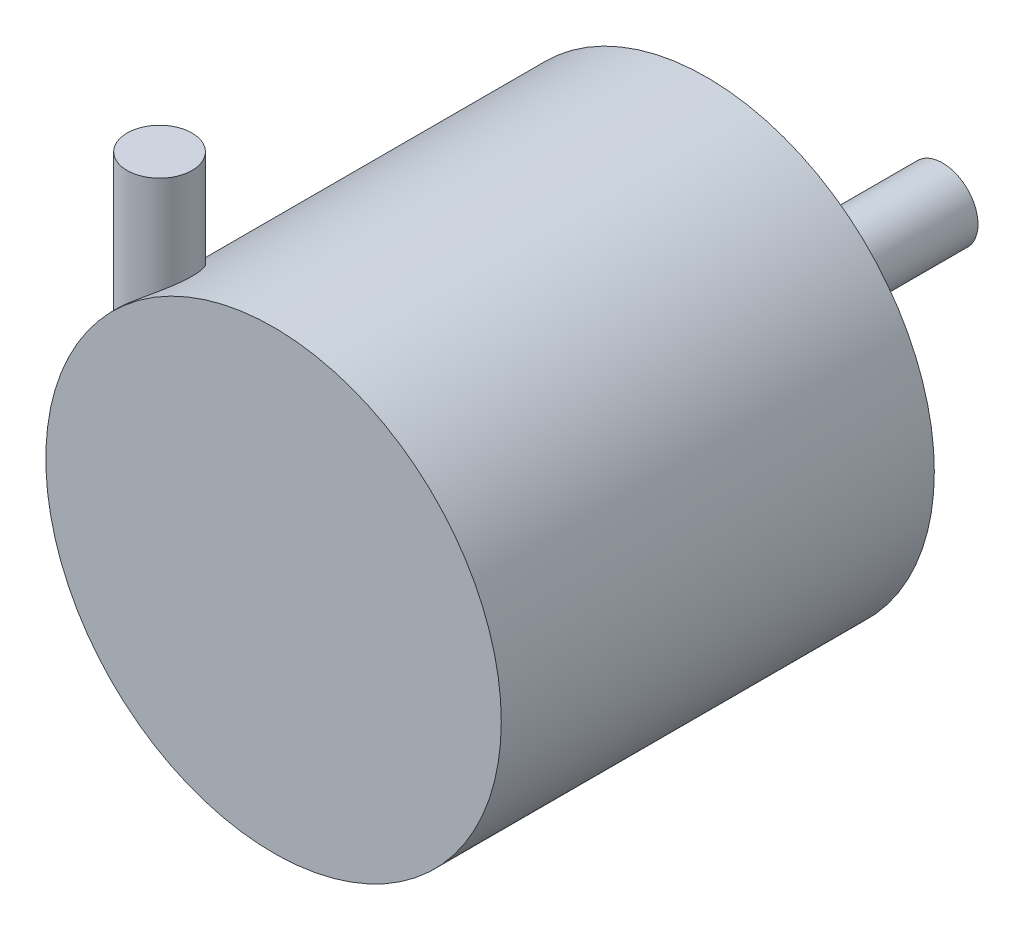
ISO-10303-21;
HEADER;
FILE_DESCRIPTION(('STEP AP214'),'2;1');
FILE_NAME('part.step','',(''),(''),'','','');
FILE_SCHEMA(('AUTOMOTIVE_DESIGN { 1 0 10303 214 1 1 1 1 }'));
ENDSEC;
DATA;
#1=APPLICATION_CONTEXT('core data for automotive mechanical design processes');
#2=APPLICATION_PROTOCOL_DEFINITION('international standard','automotive_design',2000,#1);
#3=PRODUCT_CONTEXT('',#1,'mechanical');
#4=PRODUCT('Part','Part','',(#3));
#5=PRODUCT_RELATED_PRODUCT_CATEGORY('part','',(#4));
#6=PRODUCT_DEFINITION_FORMATION('','',#4);
#7=PRODUCT_DEFINITION_CONTEXT('part definition',#1,'design');
#8=PRODUCT_DEFINITION('design','',#6,#7);
#9=PRODUCT_DEFINITION_SHAPE('','',#8);
#10=(LENGTH_UNIT() NAMED_UNIT(*) SI_UNIT(.MILLI.,.METRE.));
#11=(NAMED_UNIT(*) PLANE_ANGLE_UNIT() SI_UNIT($,.RADIAN.));
#12=(NAMED_UNIT(*) SI_UNIT($,.STERADIAN.) SOLID_ANGLE_UNIT());
#13=UNCERTAINTY_MEASURE_WITH_UNIT(LENGTH_MEASURE(1.E-05),#10,'distance_accuracy_value','');
#14=(GEOMETRIC_REPRESENTATION_CONTEXT(3) GLOBAL_UNCERTAINTY_ASSIGNED_CONTEXT((#13)) GLOBAL_UNIT_ASSIGNED_CONTEXT((#10,
#11,#12)) REPRESENTATION_CONTEXT('',''));
#15=CARTESIAN_POINT('',(0.,0.,0.));
#16=DIRECTION('',(0.,0.,1.));
#17=DIRECTION('',(1.,0.,0.));
#18=AXIS2_PLACEMENT_3D('',#15,#16,#17);
#19=CARTESIAN_POINT('',(-14.127422453689,5.37928778044314,-36.7));
#20=DIRECTION('',(0.,0.,1.));
#21=DIRECTION('',(-1.,0.,0.));
#22=AXIS2_PLACEMENT_3D('',#19,#20,#21);
#23=CYLINDRICAL_SURFACE('',#22,19.3);
#24=CARTESIAN_POINT('',(-26.8321178772339,19.9079048582987,-5.79260895022423));
#25=CARTESIAN_POINT('',(-27.0066800070135,19.7552532009059,-5.79261177430905));
#26=CARTESIAN_POINT('',(-27.1785090019566,19.5994110491946,-5.77601983857022));
#27=CARTESIAN_POINT('',(-27.513769036865,19.2842801538588,-5.7122647230237));
#28=CARTESIAN_POINT('',(-27.6771792867355,19.1249841401635,-5.66502944145783));
#29=CARTESIAN_POINT('',(-27.9306225577758,18.8692924650791,-5.56576958398866));
#30=CARTESIAN_POINT('',(-28.0242468933502,18.772788433253,-5.52292826448284));
#31=CARTESIAN_POINT('',(-28.2068953160645,18.5806510913983,-5.42654613165698));
#32=CARTESIAN_POINT('',(-28.2959176636363,18.4850181217257,-5.37300130906135));
#33=CARTESIAN_POINT('',(-28.4685732970478,18.2958571445545,-5.25516911975414));
#34=CARTESIAN_POINT('',(-28.5522154399289,18.2023258514822,-5.19090006899485));
#35=CARTESIAN_POINT('',(-28.7134771579742,18.018588885154,-5.05118066509289));
#36=CARTESIAN_POINT('',(-28.7911012202431,17.9283807609893,-4.9757387670266));
#37=CARTESIAN_POINT('',(-28.9470056207539,17.7439941931948,-4.80457125946584));
#38=CARTESIAN_POINT('',(-29.0245338543513,17.6503601924936,-4.70755797614067));
#39=CARTESIAN_POINT('',(-29.168963379427,17.4728843999137,-4.49788275697773));
#40=CARTESIAN_POINT('',(-29.2358798251021,17.3890286902811,-4.38524357498792));
#41=CARTESIAN_POINT('',(-29.342133013481,17.2539760179072,-4.17095609664688));
#42=CARTESIAN_POINT('',(-29.3842780406519,17.1996944859517,-4.0726750898426));
#43=CARTESIAN_POINT('',(-29.4580977756362,17.1037945993621,-3.86642135645428));
#44=CARTESIAN_POINT('',(-29.4897891766818,17.0621560638609,-3.75846443528842));
#45=CARTESIAN_POINT('',(-29.5353582108368,17.0019669389831,-3.55602544371768));
#46=CARTESIAN_POINT('',(-29.5514851175645,16.9805218206005,-3.46292261114173));
#47=CARTESIAN_POINT('',(-29.5740593969198,16.9504490792288,-3.27353001527166));
#48=CARTESIAN_POINT('',(-29.5805153026404,16.941810156915,-3.17724313815577));
#49=CARTESIAN_POINT('',(-29.5831939682049,16.9382295395171,-2.98407382975564));
#50=CARTESIAN_POINT('',(-29.5793966400551,16.9433147325203,-2.88719060094854));
#51=CARTESIAN_POINT('',(-29.5618744117643,16.9666901580141,-2.69594724285369));
#52=CARTESIAN_POINT('',(-29.5481421505653,16.984990181708,-2.60158903821037));
#53=CARTESIAN_POINT('',(-29.5079024240408,17.0382825510132,-2.39790156274445));
#54=CARTESIAN_POINT('',(-29.4792823587561,17.076018732442,-2.28971784891268));
#55=CARTESIAN_POINT('',(-29.4113823070416,17.1646041778752,-2.08247902617507));
#56=CARTESIAN_POINT('',(-29.3720829130943,17.2154773071694,-1.98344098103934));
#57=CARTESIAN_POINT('',(-29.2647916132384,17.3526193445063,-1.75120177875307));
#58=CARTESIAN_POINT('',(-29.1919522430041,17.4443517349356,-1.62350743367332));
#59=CARTESIAN_POINT('',(-29.0329090352744,17.6403028173095,-1.38751218203244));
#60=CARTESIAN_POINT('',(-28.9466743783164,17.7445501744065,-1.27925727158877));
#61=CARTESIAN_POINT('',(-28.7868780824205,17.9332356021145,-1.10571191102324));
#62=CARTESIAN_POINT('',(-28.7156013908345,18.0160430412258,-1.03646990423783));
#63=CARTESIAN_POINT('',(-28.5679550839503,18.1845038413416,-0.907429663549446));
#64=CARTESIAN_POINT('',(-28.4915830956033,18.2701585189491,-0.847635874282116));
#65=CARTESIAN_POINT('',(-28.3343124997573,18.4432829172039,-0.737147930342998));
#66=CARTESIAN_POINT('',(-28.2534104507619,18.5307539851386,-0.686460820511854));
#67=CARTESIAN_POINT('',(-28.08761245869,18.7066169644097,-0.594091584050342));
#68=CARTESIAN_POINT('',(-28.0027171157029,18.7950087358437,-0.55240810963689));
#69=CARTESIAN_POINT('',(-27.8269179472373,18.9745082874131,-0.4770158413664));
#70=CARTESIAN_POINT('',(-27.7359128426927,19.0656235064843,-0.443559799185951));
#71=CARTESIAN_POINT('',(-27.5505374582289,19.2474854362734,-0.386335088335878));
#72=CARTESIAN_POINT('',(-27.4561659345616,19.3382319967022,-0.362570041242938));
#73=CARTESIAN_POINT('',(-27.1688643966989,19.6088197432571,-0.306343521022828));
#74=CARTESIAN_POINT('',(-26.9714227586631,19.7873416992134,-0.288810650638244));
#75=CARTESIAN_POINT('',(-26.598748084828,20.1104799052331,-0.297136361243924));
#76=CARTESIAN_POINT('',(-26.4243976255457,20.256283571698,-0.317125145695684));
#77=CARTESIAN_POINT('',(-26.0753291140108,20.5380324582972,-0.392786350043472));
#78=CARTESIAN_POINT('',(-25.9006116728901,20.6739882930964,-0.44841969303452));
#79=CARTESIAN_POINT('',(-25.5913910794342,20.906595646007,-0.583803815683099));
#80=CARTESIAN_POINT('',(-25.455735750785,21.0057190646813,-0.656661417611186));
#81=CARTESIAN_POINT('',(-25.1934369783662,21.1925460881214,-0.828622232033075));
#82=CARTESIAN_POINT('',(-25.066783791488,21.280262127259,-0.927696503840255));
#83=CARTESIAN_POINT('',(-24.8466840401356,21.4292838046228,-1.13479065635972));
#84=CARTESIAN_POINT('',(-24.7511215472998,21.492576900213,-1.23912361738674));
#85=CARTESIAN_POINT('',(-24.5748074377253,21.6074490888352,-1.46539991786893));
#86=CARTESIAN_POINT('',(-24.4940520391025,21.6590311737837,-1.58733874634289));
#87=CARTESIAN_POINT('',(-24.3511237286162,21.7491734168411,-1.84709409795677));
#88=CARTESIAN_POINT('',(-24.2890559764532,21.7876600358369,-1.98499464276203));
#89=CARTESIAN_POINT('',(-24.187885085834,21.8498879398202,-2.27211663799976));
#90=CARTESIAN_POINT('',(-24.1487708209781,21.873636369272,-2.42133256377408));
#91=CARTESIAN_POINT('',(-24.0987717373111,21.9039042359952,-2.71011321235219));
#92=CARTESIAN_POINT('',(-24.0853973444536,21.9119444191207,-2.84909220896756));
#93=CARTESIAN_POINT('',(-24.0799092837998,21.9152494096196,-3.12759698801412));
#94=CARTESIAN_POINT('',(-24.0877879080694,21.9105188486198,-3.26712255389111));
#95=CARTESIAN_POINT('',(-24.1234938579502,21.8889500291443,-3.53596206955186));
#96=CARTESIAN_POINT('',(-24.1503789865538,21.8726835188971,-3.66544949626811));
#97=CARTESIAN_POINT('',(-24.2217156297835,21.8291199378918,-3.91751410168588));
#98=CARTESIAN_POINT('',(-24.2661674330164,21.8018226859071,-4.04009116681775));
#99=CARTESIAN_POINT('',(-24.3720013175807,21.7360162993401,-4.27865821215429));
#100=CARTESIAN_POINT('',(-24.433809597429,21.697223347441,-4.39437962971072));
#101=CARTESIAN_POINT('',(-24.5710766120266,21.6097129398695,-4.61324512602533));
#102=CARTESIAN_POINT('',(-24.6465391329931,21.5609927309705,-4.71638570289806));
#103=CARTESIAN_POINT('',(-24.8156538929468,21.4498456792291,-4.91748956555241));
#104=CARTESIAN_POINT('',(-24.910339455777,21.3865717495298,-5.01411144508802));
#105=CARTESIAN_POINT('',(-25.1089447699812,21.2509809150182,-5.18988399024465));
#106=CARTESIAN_POINT('',(-25.2128692561648,21.1786593656151,-5.26902562426476));
#107=CARTESIAN_POINT('',(-25.442826220029,21.0149646378017,-5.42043542060168));
#108=CARTESIAN_POINT('',(-25.5698339391415,20.9223617281371,-5.48988293133769));
#109=CARTESIAN_POINT('',(-25.8277866500676,20.7291245691508,-5.60656792277007));
#110=CARTESIAN_POINT('',(-25.9587330411257,20.6284874440966,-5.65379740877253));
#111=CARTESIAN_POINT('',(-26.2143132375279,20.4266180136543,-5.72541789133679));
#112=CARTESIAN_POINT('',(-26.3389042899063,20.3257139262776,-5.75090848903679));
#113=CARTESIAN_POINT('',(-26.5868142471212,20.1196936369695,-5.78450136388056));
#114=CARTESIAN_POINT('',(-26.7101333914836,20.0145782470201,-5.79260697674617));
#115=CARTESIAN_POINT('',(-26.8321178772339,19.9079048582987,-5.79260895022423));
#116=B_SPLINE_CURVE_WITH_KNOTS('',3,(#24,#25,#26,#27,#28,#29,#30,#31,#32,#33,#34,#35,#36,#37,
#38,#39,#40,#41,#42,#43,#44,#45,#46,#47,#48,#49,#50,#51,#52,#53,#54,#55,#56,#57,#58,#59,#60,#61,
#62,#63,#64,#65,#66,#67,#68,#69,#70,#71,#72,#73,#74,#75,#76,#77,#78,#79,#80,#81,#82,#83,#84,#85,
#86,#87,#88,#89,#90,#91,#92,#93,#94,#95,#96,#97,#98,#99,#100,#101,#102,#103,#104,#105,#106,#107,
#108,#109,#110,#111,#112,#113,#114,#115),.UNSPECIFIED.,.T.,.F.,(4,2,2,2,2,2,2,2,2,2,2,2,2,2,2,2,
2,2,2,2,2,2,2,2,2,2,2,2,2,2,2,2,2,2,2,2,2,2,2,2,2,2,2,2,2,4),(0.,0.695268265740766,
1.39217841417757,1.81510942020633,2.23819914390553,2.66057353133881,3.08262990401955,
3.54805301357151,4.01280536971987,4.37138980679942,4.72939882215124,5.01884078157512,
5.30802720458777,5.59778060852225,5.88774891867032,6.24009017023893,6.5930760630105,
7.11006724708808,7.62826602507812,8.0158399712929,8.40359570092308,8.79165011511106,
9.17964639986925,9.57838526591501,9.97727300654952,10.7736070743076,11.455580744725,
12.1368080480099,12.6840857101506,13.230761732519,13.6938100824053,14.1567399997406,
14.6222282312776,15.0874906367632,15.5049023942507,15.9221627873585,16.3200700684544,
16.7179838871271,17.1266820973038,17.5354938105493,17.9817825425665,18.4283013240761,
18.9419282691771,19.4557398911468,19.9416884741829,20.4275438081091),.UNSPECIFIED.);
#117=CARTESIAN_POINT('',(-26.8321178772339,19.9079048582987,-5.79260895022423));
#118=VERTEX_POINT('',#117);
#119=EDGE_CURVE('E37',#118,#118,#116,.T.);
#120=ORIENTED_EDGE('',*,*,#119,.F.);
#121=EDGE_LOOP('',(#120));
#122=FACE_BOUND('',#121,.T.);
#123=CARTESIAN_POINT('',(-14.127422453689,5.37928778044314,-36.7));
#124=DIRECTION('',(0.,0.,1.));
#125=DIRECTION('',(1.,0.,0.));
#126=AXIS2_PLACEMENT_3D('',#123,#124,#125);
#127=CIRCLE('',#126,19.3);
#128=CARTESIAN_POINT('',(5.17257754631097,5.37928778044314,-36.7));
#129=VERTEX_POINT('',#128);
#130=EDGE_CURVE('E50',#129,#129,#127,.T.);
#131=ORIENTED_EDGE('',*,*,#130,.T.);
#132=EDGE_LOOP('',(#131));
#133=FACE_BOUND('',#132,.T.);
#134=CARTESIAN_POINT('',(-14.127422453689,5.37928778044314,0.));
#135=DIRECTION('',(0.,0.,1.));
#136=DIRECTION('',(1.,0.,0.));
#137=AXIS2_PLACEMENT_3D('',#134,#135,#136);
#138=CIRCLE('',#137,19.3);
#139=CARTESIAN_POINT('',(5.17257754631097,5.37928778044314,0.));
#140=VERTEX_POINT('',#139);
#141=EDGE_CURVE('E58',#140,#140,#138,.T.);
#142=ORIENTED_EDGE('',*,*,#141,.F.);
#143=EDGE_LOOP('',(#142));
#144=FACE_BOUND('',#143,.T.);
#145=ADVANCED_FACE('F33',(#122,#133,#144),#23,.T.);
#146=CARTESIAN_POINT('',(-14.127422453689,5.37928778044314,-36.7));
#147=DIRECTION('',(0.,0.,-1.));
#148=DIRECTION('',(1.,0.,0.));
#149=AXIS2_PLACEMENT_3D('',#146,#147,#148);
#150=PLANE('',#149);
#151=CARTESIAN_POINT('',(0.862954928663456,5.91648973004398,-36.7));
#152=DIRECTION('',(0.,0.,1.));
#153=DIRECTION('',(1.,0.,0.));
#154=AXIS2_PLACEMENT_3D('',#151,#152,#153);
#155=CIRCLE('',#154,1.5);
#156=CARTESIAN_POINT('',(2.36295492866346,5.91648973004398,-36.7));
#157=VERTEX_POINT('',#156);
#158=EDGE_CURVE('E87',#157,#157,#155,.T.);
#159=ORIENTED_EDGE('',*,*,#158,.T.);
#160=EDGE_LOOP('',(#159));
#161=FACE_BOUND('',#160,.T.);
#162=CARTESIAN_POINT('',(-21.1573806095481,-7.87136081979079,-36.7));
#163=DIRECTION('',(0.,0.,1.));
#164=DIRECTION('',(1.,0.,0.));
#165=AXIS2_PLACEMENT_3D('',#162,#163,#164);
#166=CIRCLE('',#165,1.5);
#167=CARTESIAN_POINT('',(-19.6573806095481,-7.87136081979079,-36.7));
#168=VERTEX_POINT('',#167);
#169=EDGE_CURVE('E96',#168,#168,#166,.T.);
#170=ORIENTED_EDGE('',*,*,#169,.T.);
#171=EDGE_LOOP('',(#170));
#172=FACE_BOUND('',#171,.T.);
#173=CARTESIAN_POINT('',(-22.0878416801824,18.0927344310751,-36.7));
#174=DIRECTION('',(0.,0.,1.));
#175=DIRECTION('',(1.,0.,0.));
#176=AXIS2_PLACEMENT_3D('',#173,#174,#175);
#177=CIRCLE('',#176,1.5);
#178=CARTESIAN_POINT('',(-20.5878416801824,18.0927344310751,-36.7));
#179=VERTEX_POINT('',#178);
#180=EDGE_CURVE('E90',#179,#179,#177,.T.);
#181=ORIENTED_EDGE('',*,*,#180,.T.);
#182=EDGE_LOOP('',(#181));
#183=FACE_BOUND('',#182,.T.);
#184=CARTESIAN_POINT('',(-14.127422453689,5.37928778044314,-36.7));
#185=DIRECTION('',(0.,0.,1.));
#186=DIRECTION('',(1.,0.,0.));
#187=AXIS2_PLACEMENT_3D('',#184,#185,#186);
#188=CIRCLE('',#187,10.);
#189=CARTESIAN_POINT('',(-4.12742245368903,5.37928778044314,-36.7));
#190=VERTEX_POINT('',#189);
#191=EDGE_CURVE('E45',#190,#190,#188,.T.);
#192=ORIENTED_EDGE('',*,*,#191,.T.);
#193=EDGE_LOOP('',(#192));
#194=FACE_BOUND('',#193,.T.);
#195=ORIENTED_EDGE('',*,*,#130,.F.);
#196=EDGE_LOOP('',(#195));
#197=FACE_BOUND('',#196,.T.);
#198=ADVANCED_FACE('F67',(#161,#172,#183,#194,#197),#150,.T.);
#199=CARTESIAN_POINT('',(-14.127422453689,5.37928778044314,0.));
#200=DIRECTION('',(0.,0.,-1.));
#201=DIRECTION('',(1.,0.,0.));
#202=AXIS2_PLACEMENT_3D('',#199,#200,#201);
#203=PLANE('',#202);
#204=ORIENTED_EDGE('',*,*,#141,.T.);
#205=EDGE_LOOP('',(#204));
#206=FACE_BOUND('',#205,.T.);
#207=ADVANCED_FACE('F64',(#206),#203,.F.);
#208=CARTESIAN_POINT('',(-14.127422453689,5.37928778044314,-41.7));
#209=DIRECTION('',(0.,0.,1.));
#210=DIRECTION('',(-1.,0.,0.));
#211=AXIS2_PLACEMENT_3D('',#208,#209,#210);
#212=CYLINDRICAL_SURFACE('',#211,10.);
#213=CARTESIAN_POINT('',(-14.127422453689,5.37928778044314,-41.7));
#214=DIRECTION('',(0.,0.,1.));
#215=DIRECTION('',(1.,0.,0.));
#216=AXIS2_PLACEMENT_3D('',#213,#214,#215);
#217=CIRCLE('',#216,10.);
#218=CARTESIAN_POINT('',(-4.12742245368903,5.37928778044314,-41.7));
#219=VERTEX_POINT('',#218);
#220=EDGE_CURVE('E56',#219,#219,#217,.T.);
#221=ORIENTED_EDGE('',*,*,#220,.T.);
#222=EDGE_LOOP('',(#221));
#223=FACE_BOUND('',#222,.T.);
#224=ORIENTED_EDGE('',*,*,#191,.F.);
#225=EDGE_LOOP('',(#224));
#226=FACE_BOUND('',#225,.T.);
#227=ADVANCED_FACE('F151',(#223,#226),#212,.T.);
#228=CARTESIAN_POINT('',(-14.127422453689,5.37928778044314,-41.7));
#229=DIRECTION('',(0.,0.,-1.));
#230=DIRECTION('',(1.,0.,0.));
#231=AXIS2_PLACEMENT_3D('',#228,#229,#230);
#232=PLANE('',#231);
#233=CARTESIAN_POINT('',(-14.127422453689,5.37928778044314,-41.7));
#234=DIRECTION('',(0.,0.,1.));
#235=DIRECTION('',(1.,0.,0.));
#236=AXIS2_PLACEMENT_3D('',#233,#234,#235);
#237=CIRCLE('',#236,3.);
#238=CARTESIAN_POINT('',(-11.127422453689,5.37928778044314,-41.7));
#239=VERTEX_POINT('',#238);
#240=EDGE_CURVE('E10',#239,#239,#237,.T.);
#241=ORIENTED_EDGE('',*,*,#240,.T.);
#242=EDGE_LOOP('',(#241));
#243=FACE_BOUND('',#242,.T.);
#244=ORIENTED_EDGE('',*,*,#220,.F.);
#245=EDGE_LOOP('',(#244));
#246=FACE_BOUND('',#245,.T.);
#247=ADVANCED_FACE('F147',(#243,#246),#232,.T.);
#248=CARTESIAN_POINT('',(-14.127422453689,5.37928778044314,-56.7));
#249=DIRECTION('',(0.,0.,1.));
#250=DIRECTION('',(-1.,0.,0.));
#251=AXIS2_PLACEMENT_3D('',#248,#249,#250);
#252=CYLINDRICAL_SURFACE('',#251,3.);
#253=CARTESIAN_POINT('',(-14.127422453689,5.37928778044314,-56.7));
#254=DIRECTION('',(0.,0.,1.));
#255=DIRECTION('',(1.,0.,0.));
#256=AXIS2_PLACEMENT_3D('',#253,#254,#255);
#257=CIRCLE('',#256,3.);
#258=CARTESIAN_POINT('',(-11.127422453689,5.37928778044314,-56.7));
#259=VERTEX_POINT('',#258);
#260=EDGE_CURVE('E54',#259,#259,#257,.T.);
#261=ORIENTED_EDGE('',*,*,#260,.T.);
#262=EDGE_LOOP('',(#261));
#263=FACE_BOUND('',#262,.T.);
#264=ORIENTED_EDGE('',*,*,#240,.F.);
#265=EDGE_LOOP('',(#264));
#266=FACE_BOUND('',#265,.T.);
#267=ADVANCED_FACE('F143',(#263,#266),#252,.T.);
#268=CARTESIAN_POINT('',(-14.127422453689,5.37928778044314,-56.7));
#269=DIRECTION('',(0.,0.,-1.));
#270=DIRECTION('',(1.,0.,0.));
#271=AXIS2_PLACEMENT_3D('',#268,#269,#270);
#272=PLANE('',#271);
#273=ORIENTED_EDGE('',*,*,#260,.F.);
#274=EDGE_LOOP('',(#273));
#275=FACE_BOUND('',#274,.T.);
#276=ADVANCED_FACE('F140',(#275),#272,.T.);
#277=CARTESIAN_POINT('',(-26.8321178772339,9.67928778044315,-3.04260895022423));
#278=DIRECTION('',(0.,1.,0.));
#279=DIRECTION('',(0.,0.,-1.));
#280=AXIS2_PLACEMENT_3D('',#277,#278,#279);
#281=CYLINDRICAL_SURFACE('',#280,2.75);
#282=ORIENTED_EDGE('',*,*,#119,.T.);
#283=EDGE_LOOP('',(#282));
#284=FACE_BOUND('',#283,.T.);
#285=CARTESIAN_POINT('',(-26.8321178772339,29.6792877804431,-3.04260895022423));
#286=DIRECTION('',(0.,-1.,0.));
#287=DIRECTION('',(0.,0.,-1.));
#288=AXIS2_PLACEMENT_3D('',#285,#286,#287);
#289=CIRCLE('',#288,2.75);
#290=CARTESIAN_POINT('',(-26.8321178772339,29.6792877804431,-5.79260895022423));
#291=VERTEX_POINT('',#290);
#292=EDGE_CURVE('E80',#291,#291,#289,.T.);
#293=ORIENTED_EDGE('',*,*,#292,.T.);
#294=EDGE_LOOP('',(#293));
#295=FACE_BOUND('',#294,.T.);
#296=ADVANCED_FACE('F135',(#284,#295),#281,.T.);
#297=CARTESIAN_POINT('',(-26.8321178772339,29.6792877804431,-3.04260895022423));
#298=DIRECTION('',(0.,1.,0.));
#299=DIRECTION('',(0.,0.,-1.));
#300=AXIS2_PLACEMENT_3D('',#297,#298,#299);
#301=PLANE('',#300);
#302=ORIENTED_EDGE('',*,*,#292,.F.);
#303=EDGE_LOOP('',(#302));
#304=FACE_BOUND('',#303,.T.);
#305=ADVANCED_FACE('F132',(#304),#301,.T.);
#306=CARTESIAN_POINT('',(-22.0878416801824,18.0927344310751,-26.7));
#307=DIRECTION('',(0.,0.,-1.));
#308=DIRECTION('',(1.,0.,0.));
#309=AXIS2_PLACEMENT_3D('',#306,#307,#308);
#310=CYLINDRICAL_SURFACE('',#309,1.5);
#311=CARTESIAN_POINT('',(-22.0878416801824,18.0927344310751,-26.7));
#312=DIRECTION('',(0.,0.,1.));
#313=DIRECTION('',(1.,0.,0.));
#314=AXIS2_PLACEMENT_3D('',#311,#312,#313);
#315=CIRCLE('',#314,1.5);
#316=CARTESIAN_POINT('',(-20.5878416801824,18.0927344310751,-26.7));
#317=VERTEX_POINT('',#316);
#318=EDGE_CURVE('E93',#317,#317,#315,.T.);
#319=ORIENTED_EDGE('',*,*,#318,.T.);
#320=EDGE_LOOP('',(#319));
#321=FACE_BOUND('',#320,.T.);
#322=ORIENTED_EDGE('',*,*,#180,.F.);
#323=EDGE_LOOP('',(#322));
#324=FACE_BOUND('',#323,.T.);
#325=ADVANCED_FACE('F128',(#321,#324),#310,.F.);
#326=CARTESIAN_POINT('',(-22.0878416801824,18.0927344310751,-26.7));
#327=DIRECTION('',(0.,0.,-1.));
#328=DIRECTION('',(1.,0.,0.));
#329=AXIS2_PLACEMENT_3D('',#326,#327,#328);
#330=PLANE('',#329);
#331=ORIENTED_EDGE('',*,*,#318,.F.);
#332=EDGE_LOOP('',(#331));
#333=FACE_BOUND('',#332,.T.);
#334=ADVANCED_FACE('F124',(#333),#330,.T.);
#335=CARTESIAN_POINT('',(-21.1573806095481,-7.87136081979079,-26.7));
#336=DIRECTION('',(0.,0.,-1.));
#337=DIRECTION('',(1.,0.,0.));
#338=AXIS2_PLACEMENT_3D('',#335,#336,#337);
#339=CYLINDRICAL_SURFACE('',#338,1.5);
#340=CARTESIAN_POINT('',(-21.1573806095481,-7.87136081979079,-26.7));
#341=DIRECTION('',(0.,0.,1.));
#342=DIRECTION('',(1.,0.,0.));
#343=AXIS2_PLACEMENT_3D('',#340,#341,#342);
#344=CIRCLE('',#343,1.5);
#345=CARTESIAN_POINT('',(-19.6573806095481,-7.87136081979079,-26.7));
#346=VERTEX_POINT('',#345);
#347=EDGE_CURVE('E99',#346,#346,#344,.T.);
#348=ORIENTED_EDGE('',*,*,#347,.T.);
#349=EDGE_LOOP('',(#348));
#350=FACE_BOUND('',#349,.T.);
#351=ORIENTED_EDGE('',*,*,#169,.F.);
#352=EDGE_LOOP('',(#351));
#353=FACE_BOUND('',#352,.T.);
#354=ADVANCED_FACE('F118',(#350,#353),#339,.F.);
#355=CARTESIAN_POINT('',(-21.1573806095481,-7.87136081979079,-26.7));
#356=DIRECTION('',(0.,0.,-1.));
#357=DIRECTION('',(1.,0.,0.));
#358=AXIS2_PLACEMENT_3D('',#355,#356,#357);
#359=PLANE('',#358);
#360=ORIENTED_EDGE('',*,*,#347,.F.);
#361=EDGE_LOOP('',(#360));
#362=FACE_BOUND('',#361,.T.);
#363=ADVANCED_FACE('F109',(#362),#359,.T.);
#364=CARTESIAN_POINT('',(0.862954928663456,5.91648973004398,-26.7));
#365=DIRECTION('',(0.,0.,-1.));
#366=DIRECTION('',(1.,0.,0.));
#367=AXIS2_PLACEMENT_3D('',#364,#365,#366);
#368=CYLINDRICAL_SURFACE('',#367,1.5);
#369=CARTESIAN_POINT('',(0.862954928663456,5.91648973004398,-26.7));
#370=DIRECTION('',(0.,0.,1.));
#371=DIRECTION('',(1.,0.,0.));
#372=AXIS2_PLACEMENT_3D('',#369,#370,#371);
#373=CIRCLE('',#372,1.5);
#374=CARTESIAN_POINT('',(2.36295492866346,5.91648973004398,-26.7));
#375=VERTEX_POINT('',#374);
#376=EDGE_CURVE('E83',#375,#375,#373,.T.);
#377=ORIENTED_EDGE('',*,*,#376,.T.);
#378=EDGE_LOOP('',(#377));
#379=FACE_BOUND('',#378,.T.);
#380=ORIENTED_EDGE('',*,*,#158,.F.);
#381=EDGE_LOOP('',(#380));
#382=FACE_BOUND('',#381,.T.);
#383=ADVANCED_FACE('F106',(#379,#382),#368,.F.);
#384=CARTESIAN_POINT('',(0.862954928663456,5.91648973004398,-26.7));
#385=DIRECTION('',(0.,0.,-1.));
#386=DIRECTION('',(1.,0.,0.));
#387=AXIS2_PLACEMENT_3D('',#384,#385,#386);
#388=PLANE('',#387);
#389=ORIENTED_EDGE('',*,*,#376,.F.);
#390=EDGE_LOOP('',(#389));
#391=FACE_BOUND('',#390,.T.);
#392=ADVANCED_FACE('F108',(#391),#388,.T.);
#393=CLOSED_SHELL('',(#145,#198,#207,#227,#247,#267,#276,#296,#305,#325,#334,#354,#363,#383,#392));
#394=MANIFOLD_SOLID_BREP('B2',#393);
#395=ADVANCED_BREP_SHAPE_REPRESENTATION('',(#18,#394),#14);
#396=SHAPE_DEFINITION_REPRESENTATION(#9,#395);
ENDSEC;
END-ISO-10303-21;
